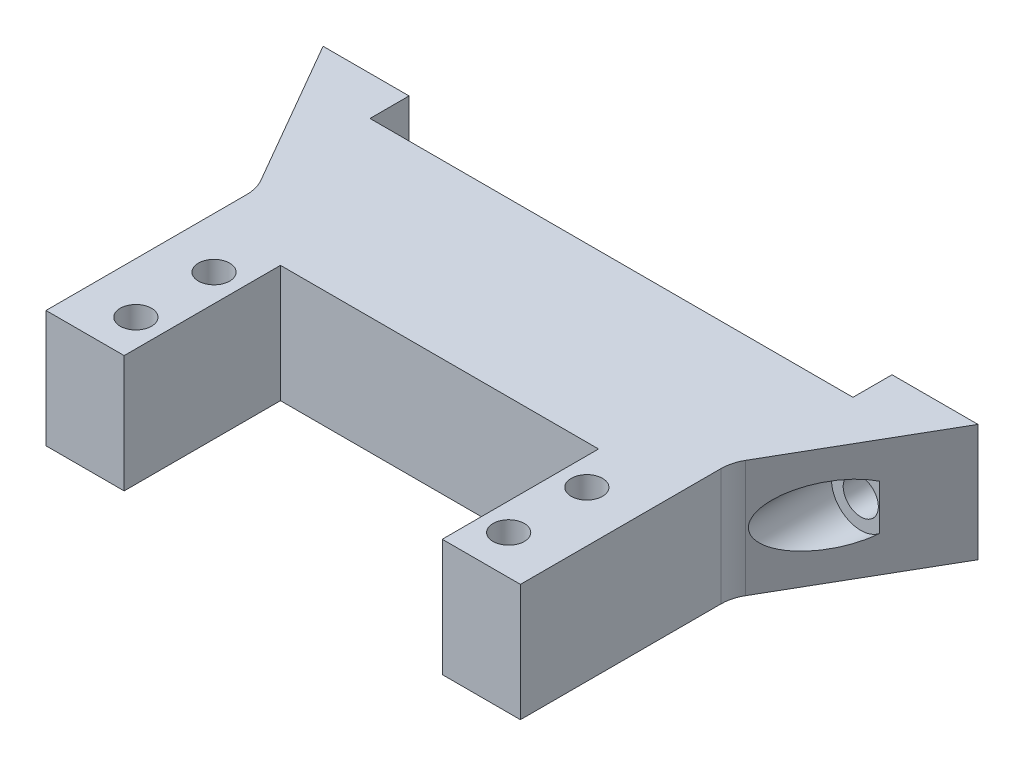
ISO-10303-21;
HEADER;
FILE_DESCRIPTION(('STEP AP214'),'2;1');
FILE_NAME('part.step','',(''),(''),'','','');
FILE_SCHEMA(('AUTOMOTIVE_DESIGN { 1 0 10303 214 1 1 1 1 }'));
ENDSEC;
DATA;
#1=APPLICATION_CONTEXT('core data for automotive mechanical design processes');
#2=APPLICATION_PROTOCOL_DEFINITION('international standard','automotive_design',2000,#1);
#3=PRODUCT_CONTEXT('',#1,'mechanical');
#4=PRODUCT('Part','Part','',(#3));
#5=PRODUCT_RELATED_PRODUCT_CATEGORY('part','',(#4));
#6=PRODUCT_DEFINITION_FORMATION('','',#4);
#7=PRODUCT_DEFINITION_CONTEXT('part definition',#1,'design');
#8=PRODUCT_DEFINITION('design','',#6,#7);
#9=PRODUCT_DEFINITION_SHAPE('','',#8);
#10=(LENGTH_UNIT() NAMED_UNIT(*) SI_UNIT(.MILLI.,.METRE.));
#11=(NAMED_UNIT(*) PLANE_ANGLE_UNIT() SI_UNIT($,.RADIAN.));
#12=(NAMED_UNIT(*) SI_UNIT($,.STERADIAN.) SOLID_ANGLE_UNIT());
#13=UNCERTAINTY_MEASURE_WITH_UNIT(LENGTH_MEASURE(1.E-05),#10,'distance_accuracy_value','');
#14=(GEOMETRIC_REPRESENTATION_CONTEXT(3) GLOBAL_UNCERTAINTY_ASSIGNED_CONTEXT((#13)) GLOBAL_UNIT_ASSIGNED_CONTEXT((#10,
#11,#12)) REPRESENTATION_CONTEXT('',''));
#15=CARTESIAN_POINT('',(0.,0.,0.));
#16=DIRECTION('',(0.,0.,1.));
#17=DIRECTION('',(1.,0.,0.));
#18=AXIS2_PLACEMENT_3D('',#15,#16,#17);
#19=CARTESIAN_POINT('',(41.8970053837926,-15.,-37.));
#20=DIRECTION('',(0.,0.,-1.));
#21=DIRECTION('',(-1.,0.,0.));
#22=AXIS2_PLACEMENT_3D('',#19,#20,#21);
#23=PLANE('',#22);
#24=DIRECTION('',(0.,-1.,0.));
#25=VECTOR('',#24,1.);
#26=CARTESIAN_POINT('',(30.8970053837926,0.,-37.));
#27=LINE('',#26,#25);
#28=CARTESIAN_POINT('',(30.8970053837926,0.,-37.));
#29=VERTEX_POINT('',#28);
#30=CARTESIAN_POINT('',(30.8970053837926,-15.,-37.));
#31=VERTEX_POINT('',#30);
#32=EDGE_CURVE('E207',#29,#31,#27,.T.);
#33=ORIENTED_EDGE('',*,*,#32,.F.);
#34=DIRECTION('',(-1.,0.,0.));
#35=VECTOR('',#34,1.);
#36=CARTESIAN_POINT('',(41.8970053837926,0.,-37.));
#37=LINE('',#36,#35);
#38=CARTESIAN_POINT('',(41.8970053837926,0.,-37.));
#39=VERTEX_POINT('',#38);
#40=EDGE_CURVE('E338',#39,#29,#37,.T.);
#41=ORIENTED_EDGE('',*,*,#40,.F.);
#42=DIRECTION('',(0.,1.,0.));
#43=VECTOR('',#42,1.);
#44=CARTESIAN_POINT('',(41.8970053837926,-15.,-37.));
#45=LINE('',#44,#43);
#46=CARTESIAN_POINT('',(41.8970053837926,-15.,-37.));
#47=VERTEX_POINT('',#46);
#48=EDGE_CURVE('E387',#47,#39,#45,.T.);
#49=ORIENTED_EDGE('',*,*,#48,.F.);
#50=DIRECTION('',(-1.,0.,0.));
#51=VECTOR('',#50,1.);
#52=CARTESIAN_POINT('',(41.8970053837926,-15.,-37.));
#53=LINE('',#52,#51);
#54=EDGE_CURVE('E289',#47,#31,#53,.T.);
#55=ORIENTED_EDGE('',*,*,#54,.T.);
#56=EDGE_LOOP('',(#33,#41,#49,#55));
#57=FACE_BOUND('',#56,.T.);
#58=CARTESIAN_POINT('',(34.8970053837926,-7.5,-37.));
#59=DIRECTION('',(0.,0.,-1.));
#60=DIRECTION('',(1.,0.,0.));
#61=AXIS2_PLACEMENT_3D('',#58,#59,#60);
#62=CIRCLE('',#61,2.25);
#63=CARTESIAN_POINT('',(37.1470053837926,-7.5,-37.));
#64=VERTEX_POINT('',#63);
#65=EDGE_CURVE('E223',#64,#64,#62,.T.);
#66=ORIENTED_EDGE('',*,*,#65,.F.);
#67=EDGE_LOOP('',(#66));
#68=FACE_BOUND('',#67,.T.);
#69=ADVANCED_FACE('F45',(#57,#68),#23,.T.);
#70=CARTESIAN_POINT('',(20.35,-15.,-10.));
#71=DIRECTION('',(-1.,0.,0.));
#72=DIRECTION('',(0.,0.,1.));
#73=AXIS2_PLACEMENT_3D('',#70,#71,#72);
#74=PLANE('',#73);
#75=DIRECTION('',(0.,0.,1.));
#76=VECTOR('',#75,1.);
#77=CARTESIAN_POINT('',(20.35,0.,-10.));
#78=LINE('',#77,#76);
#79=CARTESIAN_POINT('',(20.35,0.,-10.));
#80=VERTEX_POINT('',#79);
#81=CARTESIAN_POINT('',(20.35,0.,9.99999999999999));
#82=VERTEX_POINT('',#81);
#83=EDGE_CURVE('E263',#80,#82,#78,.T.);
#84=ORIENTED_EDGE('',*,*,#83,.F.);
#85=DIRECTION('',(0.,1.,0.));
#86=VECTOR('',#85,1.);
#87=CARTESIAN_POINT('',(20.35,-15.,-10.));
#88=LINE('',#87,#86);
#89=CARTESIAN_POINT('',(20.35,-15.,-10.));
#90=VERTEX_POINT('',#89);
#91=EDGE_CURVE('E364',#90,#80,#88,.T.);
#92=ORIENTED_EDGE('',*,*,#91,.F.);
#93=DIRECTION('',(0.,0.,1.));
#94=VECTOR('',#93,1.);
#95=CARTESIAN_POINT('',(20.35,-15.,-10.));
#96=LINE('',#95,#94);
#97=CARTESIAN_POINT('',(20.35,-15.,9.99999999999999));
#98=VERTEX_POINT('',#97);
#99=EDGE_CURVE('E267',#90,#98,#96,.T.);
#100=ORIENTED_EDGE('',*,*,#99,.T.);
#101=DIRECTION('',(0.,1.,0.));
#102=VECTOR('',#101,1.);
#103=CARTESIAN_POINT('',(20.35,-15.,9.99999999999999));
#104=LINE('',#103,#102);
#105=EDGE_CURVE('E317',#98,#82,#104,.T.);
#106=ORIENTED_EDGE('',*,*,#105,.T.);
#107=EDGE_LOOP('',(#84,#92,#100,#106));
#108=FACE_BOUND('',#107,.T.);
#109=ADVANCED_FACE('F47',(#108),#74,.T.);
#110=CARTESIAN_POINT('',(-20.35,-15.,-10.));
#111=DIRECTION('',(0.,0.,1.));
#112=DIRECTION('',(1.,0.,0.));
#113=AXIS2_PLACEMENT_3D('',#110,#111,#112);
#114=PLANE('',#113);
#115=DIRECTION('',(1.,0.,0.));
#116=VECTOR('',#115,1.);
#117=CARTESIAN_POINT('',(-20.35,0.,-10.));
#118=LINE('',#117,#116);
#119=CARTESIAN_POINT('',(-20.35,0.,-10.));
#120=VERTEX_POINT('',#119);
#121=EDGE_CURVE('E272',#120,#80,#118,.T.);
#122=ORIENTED_EDGE('',*,*,#121,.F.);
#123=DIRECTION('',(0.,1.,0.));
#124=VECTOR('',#123,1.);
#125=CARTESIAN_POINT('',(-20.35,-15.,-10.));
#126=LINE('',#125,#124);
#127=CARTESIAN_POINT('',(-20.35,-15.,-10.));
#128=VERTEX_POINT('',#127);
#129=EDGE_CURVE('E368',#128,#120,#126,.T.);
#130=ORIENTED_EDGE('',*,*,#129,.F.);
#131=DIRECTION('',(1.,0.,0.));
#132=VECTOR('',#131,1.);
#133=CARTESIAN_POINT('',(-20.35,-15.,-10.));
#134=LINE('',#133,#132);
#135=EDGE_CURVE('E313',#128,#90,#134,.T.);
#136=ORIENTED_EDGE('',*,*,#135,.T.);
#137=ORIENTED_EDGE('',*,*,#91,.T.);
#138=EDGE_LOOP('',(#122,#130,#136,#137));
#139=FACE_BOUND('',#138,.T.);
#140=ADVANCED_FACE('F435',(#139),#114,.T.);
#141=CARTESIAN_POINT('',(-20.35,-15.,10.));
#142=DIRECTION('',(1.,0.,0.));
#143=DIRECTION('',(0.,0.,-1.));
#144=AXIS2_PLACEMENT_3D('',#141,#142,#143);
#145=PLANE('',#144);
#146=DIRECTION('',(0.,0.,-1.));
#147=VECTOR('',#146,1.);
#148=CARTESIAN_POINT('',(-20.35,0.,10.));
#149=LINE('',#148,#147);
#150=CARTESIAN_POINT('',(-20.35,0.,10.));
#151=VERTEX_POINT('',#150);
#152=EDGE_CURVE('E357',#151,#120,#149,.T.);
#153=ORIENTED_EDGE('',*,*,#152,.F.);
#154=DIRECTION('',(0.,1.,0.));
#155=VECTOR('',#154,1.);
#156=CARTESIAN_POINT('',(-20.35,-15.,10.));
#157=LINE('',#156,#155);
#158=CARTESIAN_POINT('',(-20.35,-15.,10.));
#159=VERTEX_POINT('',#158);
#160=EDGE_CURVE('E371',#159,#151,#157,.T.);
#161=ORIENTED_EDGE('',*,*,#160,.F.);
#162=DIRECTION('',(0.,0.,-1.));
#163=VECTOR('',#162,1.);
#164=CARTESIAN_POINT('',(-20.35,-15.,10.));
#165=LINE('',#164,#163);
#166=EDGE_CURVE('E309',#159,#128,#165,.T.);
#167=ORIENTED_EDGE('',*,*,#166,.T.);
#168=ORIENTED_EDGE('',*,*,#129,.T.);
#169=EDGE_LOOP('',(#153,#161,#167,#168));
#170=FACE_BOUND('',#169,.T.);
#171=ADVANCED_FACE('F495',(#170),#145,.T.);
#172=CARTESIAN_POINT('',(-20.35,-15.,10.));
#173=DIRECTION('',(0.,0.,1.));
#174=DIRECTION('',(1.,0.,0.));
#175=AXIS2_PLACEMENT_3D('',#172,#173,#174);
#176=PLANE('',#175);
#177=DIRECTION('',(1.,0.,0.));
#178=VECTOR('',#177,1.);
#179=CARTESIAN_POINT('',(-20.35,0.,10.));
#180=LINE('',#179,#178);
#181=CARTESIAN_POINT('',(-30.35,0.,10.));
#182=VERTEX_POINT('',#181);
#183=EDGE_CURVE('E353',#182,#151,#180,.T.);
#184=ORIENTED_EDGE('',*,*,#183,.F.);
#185=DIRECTION('',(0.,1.,0.));
#186=VECTOR('',#185,1.);
#187=CARTESIAN_POINT('',(-30.35,-15.,10.));
#188=LINE('',#187,#186);
#189=CARTESIAN_POINT('',(-30.35,-15.,10.));
#190=VERTEX_POINT('',#189);
#191=EDGE_CURVE('E374',#190,#182,#188,.T.);
#192=ORIENTED_EDGE('',*,*,#191,.F.);
#193=DIRECTION('',(1.,0.,0.));
#194=VECTOR('',#193,1.);
#195=CARTESIAN_POINT('',(-20.35,-15.,10.));
#196=LINE('',#195,#194);
#197=EDGE_CURVE('E305',#190,#159,#196,.T.);
#198=ORIENTED_EDGE('',*,*,#197,.T.);
#199=ORIENTED_EDGE('',*,*,#160,.T.);
#200=EDGE_LOOP('',(#184,#192,#198,#199));
#201=FACE_BOUND('',#200,.T.);
#202=ADVANCED_FACE('F499',(#201),#176,.T.);
#203=CARTESIAN_POINT('',(-30.35,-15.,10.));
#204=DIRECTION('',(-1.,0.,0.));
#205=DIRECTION('',(0.,0.,1.));
#206=AXIS2_PLACEMENT_3D('',#203,#204,#205);
#207=PLANE('',#206);
#208=DIRECTION('',(0.,0.,1.));
#209=VECTOR('',#208,1.);
#210=CARTESIAN_POINT('',(-30.35,0.,10.));
#211=LINE('',#210,#209);
#212=CARTESIAN_POINT('',(-30.35,0.,-15.6602540378444));
#213=VERTEX_POINT('',#212);
#214=EDGE_CURVE('E349',#213,#182,#211,.T.);
#215=ORIENTED_EDGE('',*,*,#214,.F.);
#216=DIRECTION('',(0.,1.,0.));
#217=VECTOR('',#216,1.);
#218=CARTESIAN_POINT('',(-30.35,-15.,-15.6602540378444));
#219=LINE('',#218,#217);
#220=CARTESIAN_POINT('',(-30.35,-15.,-15.6602540378444));
#221=VERTEX_POINT('',#220);
#222=EDGE_CURVE('E377',#221,#213,#219,.T.);
#223=ORIENTED_EDGE('',*,*,#222,.F.);
#224=DIRECTION('',(0.,0.,1.));
#225=VECTOR('',#224,1.);
#226=CARTESIAN_POINT('',(-30.35,-15.,10.));
#227=LINE('',#226,#225);
#228=EDGE_CURVE('E301',#221,#190,#227,.T.);
#229=ORIENTED_EDGE('',*,*,#228,.T.);
#230=ORIENTED_EDGE('',*,*,#191,.T.);
#231=EDGE_LOOP('',(#215,#223,#229,#230));
#232=FACE_BOUND('',#231,.T.);
#233=ADVANCED_FACE('F503',(#232),#207,.T.);
#234=CARTESIAN_POINT('',(-35.35,-15.,-15.6602540378444));
#235=DIRECTION('',(0.,1.,0.));
#236=DIRECTION('',(0.,0.,1.));
#237=AXIS2_PLACEMENT_3D('',#234,#235,#236);
#238=CYLINDRICAL_SURFACE('',#237,4.99999999999999);
#239=CARTESIAN_POINT('',(-35.35,0.,-15.6602540378444));
#240=DIRECTION('',(0.,-1.,0.));
#241=DIRECTION('',(0.,0.,1.));
#242=AXIS2_PLACEMENT_3D('',#239,#240,#241);
#243=CIRCLE('',#242,4.99999999999999);
#244=CARTESIAN_POINT('',(-31.0198729810778,0.,-18.1602540378444));
#245=VERTEX_POINT('',#244);
#246=EDGE_CURVE('E345',#245,#213,#243,.T.);
#247=ORIENTED_EDGE('',*,*,#246,.F.);
#248=DIRECTION('',(0.,1.,0.));
#249=VECTOR('',#248,1.);
#250=CARTESIAN_POINT('',(-31.0198729810778,-15.,-18.1602540378444));
#251=LINE('',#250,#249);
#252=CARTESIAN_POINT('',(-31.0198729810778,-15.,-18.1602540378444));
#253=VERTEX_POINT('',#252);
#254=EDGE_CURVE('E380',#253,#245,#251,.T.);
#255=ORIENTED_EDGE('',*,*,#254,.F.);
#256=CARTESIAN_POINT('',(-35.35,-15.,-15.6602540378444));
#257=DIRECTION('',(0.,-1.,0.));
#258=DIRECTION('',(0.,0.,1.));
#259=AXIS2_PLACEMENT_3D('',#256,#257,#258);
#260=CIRCLE('',#259,4.99999999999999);
#261=EDGE_CURVE('E297',#253,#221,#260,.T.);
#262=ORIENTED_EDGE('',*,*,#261,.T.);
#263=ORIENTED_EDGE('',*,*,#222,.T.);
#264=EDGE_LOOP('',(#247,#255,#262,#263));
#265=FACE_BOUND('',#264,.T.);
#266=ADVANCED_FACE('F450',(#265),#238,.F.);
#267=CARTESIAN_POINT('',(-31.0198729810778,-15.,-18.1602540378444));
#268=DIRECTION('',(-0.866025403784438,0.,0.500000000000002));
#269=DIRECTION('',(0.500000000000002,0.,0.866025403784438));
#270=AXIS2_PLACEMENT_3D('',#267,#268,#269);
#271=PLANE('',#270);
#272=CARTESIAN_POINT('',(-34.8970053837926,-7.5,-24.8756443470179));
#273=DIRECTION('',(-0.866025403784438,0.,0.500000000000002));
#274=DIRECTION('',(-0.500000000000002,0.,-0.866025403784438));
#275=AXIS2_PLACEMENT_3D('',#272,#273,#274);
#276=ELLIPSE('',#275,7.49999999999998,3.75);
#277=CARTESIAN_POINT('',(-37.2782032302755,-10.3969633784197,-29.));
#278=VERTEX_POINT('',#277);
#279=CARTESIAN_POINT('',(-37.2782032302755,-4.60303662158031,-29.));
#280=VERTEX_POINT('',#279);
#281=EDGE_CURVE('E11',#278,#280,#276,.T.);
#282=ORIENTED_EDGE('',*,*,#281,.F.);
#283=DIRECTION('',(0.,1.,0.));
#284=VECTOR('',#283,1.);
#285=CARTESIAN_POINT('',(-37.2782032302755,-15.,-29.));
#286=LINE('',#285,#284);
#287=EDGE_CURVE('E54',#278,#280,#286,.T.);
#288=ORIENTED_EDGE('',*,*,#287,.T.);
#289=EDGE_LOOP('',(#282,#288));
#290=FACE_BOUND('',#289,.T.);
#291=DIRECTION('',(0.500000000000002,0.,0.866025403784438));
#292=VECTOR('',#291,1.);
#293=CARTESIAN_POINT('',(-31.0198729810778,0.,-18.1602540378444));
#294=LINE('',#293,#292);
#295=CARTESIAN_POINT('',(-41.8970053837926,0.,-37.));
#296=VERTEX_POINT('',#295);
#297=EDGE_CURVE('E341',#296,#245,#294,.T.);
#298=ORIENTED_EDGE('',*,*,#297,.F.);
#299=DIRECTION('',(0.,1.,0.));
#300=VECTOR('',#299,1.);
#301=CARTESIAN_POINT('',(-41.8970053837926,-15.,-37.));
#302=LINE('',#301,#300);
#303=CARTESIAN_POINT('',(-41.8970053837926,-15.,-37.));
#304=VERTEX_POINT('',#303);
#305=EDGE_CURVE('E383',#304,#296,#302,.T.);
#306=ORIENTED_EDGE('',*,*,#305,.F.);
#307=DIRECTION('',(0.500000000000002,0.,0.866025403784438));
#308=VECTOR('',#307,1.);
#309=CARTESIAN_POINT('',(-31.0198729810778,-15.,-18.1602540378444));
#310=LINE('',#309,#308);
#311=EDGE_CURVE('E293',#304,#253,#310,.T.);
#312=ORIENTED_EDGE('',*,*,#311,.T.);
#313=ORIENTED_EDGE('',*,*,#254,.T.);
#314=EDGE_LOOP('',(#298,#306,#312,#313));
#315=FACE_BOUND('',#314,.T.);
#316=ADVANCED_FACE('F410',(#290,#315),#271,.T.);
#317=DIRECTION('',(0.,-1.,0.));
#318=VECTOR('',#317,1.);
#319=CARTESIAN_POINT('',(-30.8970053837926,0.,-37.));
#320=LINE('',#319,#318);
#321=CARTESIAN_POINT('',(-30.8970053837926,0.,-37.));
#322=VERTEX_POINT('',#321);
#323=CARTESIAN_POINT('',(-30.8970053837926,-15.,-37.));
#324=VERTEX_POINT('',#323);
#325=EDGE_CURVE('E61',#322,#324,#320,.T.);
#326=ORIENTED_EDGE('',*,*,#325,.T.);
#327=EDGE_CURVE('E288',#324,#304,#53,.T.);
#328=ORIENTED_EDGE('',*,*,#327,.T.);
#329=ORIENTED_EDGE('',*,*,#305,.T.);
#330=EDGE_CURVE('E337',#322,#296,#37,.T.);
#331=ORIENTED_EDGE('',*,*,#330,.F.);
#332=EDGE_LOOP('',(#326,#328,#329,#331));
#333=FACE_BOUND('',#332,.T.);
#334=CARTESIAN_POINT('',(-34.8970053837926,-7.5,-37.));
#335=DIRECTION('',(0.,0.,-1.));
#336=DIRECTION('',(-1.,0.,0.));
#337=AXIS2_PLACEMENT_3D('',#334,#335,#336);
#338=CIRCLE('',#337,2.25);
#339=CARTESIAN_POINT('',(-37.1470053837926,-7.5,-37.));
#340=VERTEX_POINT('',#339);
#341=EDGE_CURVE('E224',#340,#340,#338,.T.);
#342=ORIENTED_EDGE('',*,*,#341,.F.);
#343=EDGE_LOOP('',(#342));
#344=FACE_BOUND('',#343,.T.);
#345=ADVANCED_FACE('F430',(#333,#344),#23,.T.);
#346=CARTESIAN_POINT('',(31.0198729810778,-15.,-18.1602540378444));
#347=DIRECTION('',(0.866025403784438,0.,0.500000000000001));
#348=DIRECTION('',(0.500000000000001,0.,-0.866025403784438));
#349=AXIS2_PLACEMENT_3D('',#346,#347,#348);
#350=PLANE('',#349);
#351=CARTESIAN_POINT('',(34.8970053837926,-7.5,-24.8756443470179));
#352=DIRECTION('',(0.866025403784438,0.,0.500000000000001));
#353=DIRECTION('',(0.500000000000001,0.,-0.866025403784438));
#354=AXIS2_PLACEMENT_3D('',#351,#352,#353);
#355=ELLIPSE('',#354,7.49999999999998,3.75);
#356=CARTESIAN_POINT('',(37.2782032302755,-4.6030366215803,-29.));
#357=VERTEX_POINT('',#356);
#358=CARTESIAN_POINT('',(37.2782032302755,-10.3969633784197,-29.));
#359=VERTEX_POINT('',#358);
#360=EDGE_CURVE('E403',#357,#359,#355,.T.);
#361=ORIENTED_EDGE('',*,*,#360,.F.);
#362=DIRECTION('',(0.,1.,0.));
#363=VECTOR('',#362,1.);
#364=CARTESIAN_POINT('',(37.2782032302755,-15.,-29.));
#365=LINE('',#364,#363);
#366=EDGE_CURVE('E367',#359,#357,#365,.T.);
#367=ORIENTED_EDGE('',*,*,#366,.F.);
#368=EDGE_LOOP('',(#361,#367));
#369=FACE_BOUND('',#368,.T.);
#370=DIRECTION('',(0.500000000000001,0.,-0.866025403784438));
#371=VECTOR('',#370,1.);
#372=CARTESIAN_POINT('',(31.0198729810778,0.,-18.1602540378444));
#373=LINE('',#372,#371);
#374=CARTESIAN_POINT('',(31.0198729810778,0.,-18.1602540378444));
#375=VERTEX_POINT('',#374);
#376=EDGE_CURVE('E333',#375,#39,#373,.T.);
#377=ORIENTED_EDGE('',*,*,#376,.F.);
#378=DIRECTION('',(0.,1.,0.));
#379=VECTOR('',#378,1.);
#380=CARTESIAN_POINT('',(31.0198729810778,-15.,-18.1602540378444));
#381=LINE('',#380,#379);
#382=CARTESIAN_POINT('',(31.0198729810778,-15.,-18.1602540378444));
#383=VERTEX_POINT('',#382);
#384=EDGE_CURVE('E390',#383,#375,#381,.T.);
#385=ORIENTED_EDGE('',*,*,#384,.F.);
#386=DIRECTION('',(0.500000000000001,0.,-0.866025403784438));
#387=VECTOR('',#386,1.);
#388=CARTESIAN_POINT('',(31.0198729810778,-15.,-18.1602540378444));
#389=LINE('',#388,#387);
#390=EDGE_CURVE('E284',#383,#47,#389,.T.);
#391=ORIENTED_EDGE('',*,*,#390,.T.);
#392=ORIENTED_EDGE('',*,*,#48,.T.);
#393=EDGE_LOOP('',(#377,#385,#391,#392));
#394=FACE_BOUND('',#393,.T.);
#395=ADVANCED_FACE('F441',(#369,#394),#350,.T.);
#396=CARTESIAN_POINT('',(35.35,-15.,-15.6602540378444));
#397=DIRECTION('',(0.,1.,0.));
#398=DIRECTION('',(0.,0.,1.));
#399=AXIS2_PLACEMENT_3D('',#396,#397,#398);
#400=CYLINDRICAL_SURFACE('',#399,4.99999999999999);
#401=CARTESIAN_POINT('',(35.35,0.,-15.6602540378444));
#402=DIRECTION('',(0.,-1.,0.));
#403=DIRECTION('',(0.,0.,-1.));
#404=AXIS2_PLACEMENT_3D('',#401,#402,#403);
#405=CIRCLE('',#404,4.99999999999999);
#406=CARTESIAN_POINT('',(30.35,0.,-15.6602540378444));
#407=VERTEX_POINT('',#406);
#408=EDGE_CURVE('E329',#407,#375,#405,.T.);
#409=ORIENTED_EDGE('',*,*,#408,.F.);
#410=DIRECTION('',(0.,1.,0.));
#411=VECTOR('',#410,1.);
#412=CARTESIAN_POINT('',(30.35,-15.,-15.6602540378444));
#413=LINE('',#412,#411);
#414=CARTESIAN_POINT('',(30.35,-15.,-15.6602540378444));
#415=VERTEX_POINT('',#414);
#416=EDGE_CURVE('E393',#415,#407,#413,.T.);
#417=ORIENTED_EDGE('',*,*,#416,.F.);
#418=CARTESIAN_POINT('',(35.35,-15.,-15.6602540378444));
#419=DIRECTION('',(0.,-1.,0.));
#420=DIRECTION('',(0.,0.,-1.));
#421=AXIS2_PLACEMENT_3D('',#418,#419,#420);
#422=CIRCLE('',#421,4.99999999999999);
#423=EDGE_CURVE('E280',#415,#383,#422,.T.);
#424=ORIENTED_EDGE('',*,*,#423,.T.);
#425=ORIENTED_EDGE('',*,*,#384,.T.);
#426=EDGE_LOOP('',(#409,#417,#424,#425));
#427=FACE_BOUND('',#426,.T.);
#428=ADVANCED_FACE('F447',(#427),#400,.F.);
#429=CARTESIAN_POINT('',(30.35,-15.,10.));
#430=DIRECTION('',(1.,0.,0.));
#431=DIRECTION('',(0.,0.,-1.));
#432=AXIS2_PLACEMENT_3D('',#429,#430,#431);
#433=PLANE('',#432);
#434=DIRECTION('',(0.,0.,-1.));
#435=VECTOR('',#434,1.);
#436=CARTESIAN_POINT('',(30.35,0.,10.));
#437=LINE('',#436,#435);
#438=CARTESIAN_POINT('',(30.35,0.,10.));
#439=VERTEX_POINT('',#438);
#440=EDGE_CURVE('E325',#439,#407,#437,.T.);
#441=ORIENTED_EDGE('',*,*,#440,.F.);
#442=DIRECTION('',(0.,1.,0.));
#443=VECTOR('',#442,1.);
#444=CARTESIAN_POINT('',(30.35,-15.,10.));
#445=LINE('',#444,#443);
#446=CARTESIAN_POINT('',(30.35,-15.,10.));
#447=VERTEX_POINT('',#446);
#448=EDGE_CURVE('E396',#447,#439,#445,.T.);
#449=ORIENTED_EDGE('',*,*,#448,.F.);
#450=DIRECTION('',(0.,0.,-1.));
#451=VECTOR('',#450,1.);
#452=CARTESIAN_POINT('',(30.35,-15.,10.));
#453=LINE('',#452,#451);
#454=EDGE_CURVE('E276',#447,#415,#453,.T.);
#455=ORIENTED_EDGE('',*,*,#454,.T.);
#456=ORIENTED_EDGE('',*,*,#416,.T.);
#457=EDGE_LOOP('',(#441,#449,#455,#456));
#458=FACE_BOUND('',#457,.T.);
#459=ADVANCED_FACE('F536',(#458),#433,.T.);
#460=CARTESIAN_POINT('',(20.35,-15.,9.99999999999999));
#461=DIRECTION('',(0.,0.,1.));
#462=DIRECTION('',(1.,0.,0.));
#463=AXIS2_PLACEMENT_3D('',#460,#461,#462);
#464=PLANE('',#463);
#465=DIRECTION('',(1.,0.,0.));
#466=VECTOR('',#465,1.);
#467=CARTESIAN_POINT('',(20.35,0.,9.99999999999999));
#468=LINE('',#467,#466);
#469=EDGE_CURVE('E321',#82,#439,#468,.T.);
#470=ORIENTED_EDGE('',*,*,#469,.F.);
#471=ORIENTED_EDGE('',*,*,#105,.F.);
#472=DIRECTION('',(1.,0.,0.));
#473=VECTOR('',#472,1.);
#474=CARTESIAN_POINT('',(20.35,-15.,9.99999999999999));
#475=LINE('',#474,#473);
#476=EDGE_CURVE('E271',#98,#447,#475,.T.);
#477=ORIENTED_EDGE('',*,*,#476,.T.);
#478=ORIENTED_EDGE('',*,*,#448,.T.);
#479=EDGE_LOOP('',(#470,#471,#477,#478));
#480=FACE_BOUND('',#479,.T.);
#481=ADVANCED_FACE('F488',(#480),#464,.T.);
#482=CARTESIAN_POINT('',(35.35,-15.,-15.6602540378444));
#483=DIRECTION('',(0.,-1.,0.));
#484=DIRECTION('',(0.,0.,-1.));
#485=AXIS2_PLACEMENT_3D('',#482,#483,#484);
#486=PLANE('',#485);
#487=DIRECTION('',(0.,0.,1.));
#488=VECTOR('',#487,1.);
#489=CARTESIAN_POINT('',(30.8970053837926,-15.,-37.));
#490=LINE('',#489,#488);
#491=CARTESIAN_POINT('',(30.8970053837926,-15.,-32.));
#492=VERTEX_POINT('',#491);
#493=EDGE_CURVE('E191',#31,#492,#490,.T.);
#494=ORIENTED_EDGE('',*,*,#493,.F.);
#495=ORIENTED_EDGE('',*,*,#54,.F.);
#496=ORIENTED_EDGE('',*,*,#390,.F.);
#497=ORIENTED_EDGE('',*,*,#423,.F.);
#498=ORIENTED_EDGE('',*,*,#454,.F.);
#499=ORIENTED_EDGE('',*,*,#476,.F.);
#500=ORIENTED_EDGE('',*,*,#99,.F.);
#501=ORIENTED_EDGE('',*,*,#135,.F.);
#502=ORIENTED_EDGE('',*,*,#166,.F.);
#503=ORIENTED_EDGE('',*,*,#197,.F.);
#504=ORIENTED_EDGE('',*,*,#228,.F.);
#505=ORIENTED_EDGE('',*,*,#261,.F.);
#506=ORIENTED_EDGE('',*,*,#311,.F.);
#507=ORIENTED_EDGE('',*,*,#327,.F.);
#508=DIRECTION('',(0.,0.,-1.));
#509=VECTOR('',#508,1.);
#510=CARTESIAN_POINT('',(-30.8970053837926,-15.,-37.));
#511=LINE('',#510,#509);
#512=CARTESIAN_POINT('',(-30.8970053837926,-15.,-32.));
#513=VERTEX_POINT('',#512);
#514=EDGE_CURVE('E195',#513,#324,#511,.T.);
#515=ORIENTED_EDGE('',*,*,#514,.F.);
#516=DIRECTION('',(-1.,0.,0.));
#517=VECTOR('',#516,1.);
#518=CARTESIAN_POINT('',(-30.8970053837926,-15.,-32.));
#519=LINE('',#518,#517);
#520=EDGE_CURVE('E177',#492,#513,#519,.T.);
#521=ORIENTED_EDGE('',*,*,#520,.F.);
#522=EDGE_LOOP('',(#494,#495,#496,#497,#498,#499,#500,#501,#502,#503,#504,#505,#506,#507,#515,#521));
#523=FACE_BOUND('',#522,.T.);
#524=CARTESIAN_POINT('',(23.85,-15.,5.));
#525=DIRECTION('',(0.,1.,0.));
#526=DIRECTION('',(0.,0.,-1.));
#527=AXIS2_PLACEMENT_3D('',#524,#525,#526);
#528=CIRCLE('',#527,2.);
#529=CARTESIAN_POINT('',(23.85,-15.,3.));
#530=VERTEX_POINT('',#529);
#531=EDGE_CURVE('E235',#530,#530,#528,.T.);
#532=ORIENTED_EDGE('',*,*,#531,.T.);
#533=EDGE_LOOP('',(#532));
#534=FACE_BOUND('',#533,.T.);
#535=CARTESIAN_POINT('',(23.85,-15.,-5.));
#536=DIRECTION('',(0.,1.,0.));
#537=DIRECTION('',(0.,0.,-1.));
#538=AXIS2_PLACEMENT_3D('',#535,#536,#537);
#539=CIRCLE('',#538,2.);
#540=CARTESIAN_POINT('',(23.85,-15.,-7.));
#541=VERTEX_POINT('',#540);
#542=EDGE_CURVE('E243',#541,#541,#539,.T.);
#543=ORIENTED_EDGE('',*,*,#542,.T.);
#544=EDGE_LOOP('',(#543));
#545=FACE_BOUND('',#544,.T.);
#546=CARTESIAN_POINT('',(-23.85,-15.,5.));
#547=DIRECTION('',(0.,1.,0.));
#548=DIRECTION('',(0.,0.,1.));
#549=AXIS2_PLACEMENT_3D('',#546,#547,#548);
#550=CIRCLE('',#549,2.);
#551=CARTESIAN_POINT('',(-23.85,-15.,7.));
#552=VERTEX_POINT('',#551);
#553=EDGE_CURVE('E251',#552,#552,#550,.T.);
#554=ORIENTED_EDGE('',*,*,#553,.T.);
#555=EDGE_LOOP('',(#554));
#556=FACE_BOUND('',#555,.T.);
#557=CARTESIAN_POINT('',(-23.85,-15.,-5.));
#558=DIRECTION('',(0.,1.,0.));
#559=DIRECTION('',(0.,0.,1.));
#560=AXIS2_PLACEMENT_3D('',#557,#558,#559);
#561=CIRCLE('',#560,2.);
#562=CARTESIAN_POINT('',(-23.85,-15.,-3.));
#563=VERTEX_POINT('',#562);
#564=EDGE_CURVE('E259',#563,#563,#561,.T.);
#565=ORIENTED_EDGE('',*,*,#564,.T.);
#566=EDGE_LOOP('',(#565));
#567=FACE_BOUND('',#566,.T.);
#568=ADVANCED_FACE('F486',(#523,#534,#545,#556,#567),#486,.T.);
#569=CARTESIAN_POINT('',(35.35,0.,-15.6602540378444));
#570=DIRECTION('',(0.,-1.,0.));
#571=DIRECTION('',(0.,0.,-1.));
#572=AXIS2_PLACEMENT_3D('',#569,#570,#571);
#573=PLANE('',#572);
#574=CARTESIAN_POINT('',(23.85,0.,5.));
#575=DIRECTION('',(0.,1.,0.));
#576=DIRECTION('',(0.,0.,-1.));
#577=AXIS2_PLACEMENT_3D('',#574,#575,#576);
#578=CIRCLE('',#577,2.);
#579=CARTESIAN_POINT('',(23.85,0.,3.));
#580=VERTEX_POINT('',#579);
#581=EDGE_CURVE('E228',#580,#580,#578,.T.);
#582=ORIENTED_EDGE('',*,*,#581,.F.);
#583=EDGE_LOOP('',(#582));
#584=FACE_BOUND('',#583,.T.);
#585=CARTESIAN_POINT('',(23.85,0.,-5.));
#586=DIRECTION('',(0.,1.,0.));
#587=DIRECTION('',(0.,0.,-1.));
#588=AXIS2_PLACEMENT_3D('',#585,#586,#587);
#589=CIRCLE('',#588,2.);
#590=CARTESIAN_POINT('',(23.85,0.,-7.));
#591=VERTEX_POINT('',#590);
#592=EDGE_CURVE('E239',#591,#591,#589,.T.);
#593=ORIENTED_EDGE('',*,*,#592,.F.);
#594=EDGE_LOOP('',(#593));
#595=FACE_BOUND('',#594,.T.);
#596=CARTESIAN_POINT('',(-23.85,0.,5.));
#597=DIRECTION('',(0.,1.,0.));
#598=DIRECTION('',(0.,0.,1.));
#599=AXIS2_PLACEMENT_3D('',#596,#597,#598);
#600=CIRCLE('',#599,2.);
#601=CARTESIAN_POINT('',(-23.85,0.,7.));
#602=VERTEX_POINT('',#601);
#603=EDGE_CURVE('E247',#602,#602,#600,.T.);
#604=ORIENTED_EDGE('',*,*,#603,.F.);
#605=EDGE_LOOP('',(#604));
#606=FACE_BOUND('',#605,.T.);
#607=CARTESIAN_POINT('',(-23.85,0.,-5.));
#608=DIRECTION('',(0.,1.,0.));
#609=DIRECTION('',(0.,0.,1.));
#610=AXIS2_PLACEMENT_3D('',#607,#608,#609);
#611=CIRCLE('',#610,2.);
#612=CARTESIAN_POINT('',(-23.85,0.,-3.));
#613=VERTEX_POINT('',#612);
#614=EDGE_CURVE('E255',#613,#613,#611,.T.);
#615=ORIENTED_EDGE('',*,*,#614,.F.);
#616=EDGE_LOOP('',(#615));
#617=FACE_BOUND('',#616,.T.);
#618=ORIENTED_EDGE('',*,*,#40,.T.);
#619=DIRECTION('',(0.,0.,1.));
#620=VECTOR('',#619,1.);
#621=CARTESIAN_POINT('',(30.8970053837926,0.,-37.));
#622=LINE('',#621,#620);
#623=CARTESIAN_POINT('',(30.8970053837926,0.,-32.));
#624=VERTEX_POINT('',#623);
#625=EDGE_CURVE('E180',#29,#624,#622,.T.);
#626=ORIENTED_EDGE('',*,*,#625,.T.);
#627=DIRECTION('',(-1.,0.,0.));
#628=VECTOR('',#627,1.);
#629=CARTESIAN_POINT('',(-30.8970053837926,0.,-32.));
#630=LINE('',#629,#628);
#631=CARTESIAN_POINT('',(-30.8970053837926,0.,-32.));
#632=VERTEX_POINT('',#631);
#633=EDGE_CURVE('E174',#624,#632,#630,.T.);
#634=ORIENTED_EDGE('',*,*,#633,.T.);
#635=DIRECTION('',(0.,0.,-1.));
#636=VECTOR('',#635,1.);
#637=CARTESIAN_POINT('',(-30.8970053837926,0.,-37.));
#638=LINE('',#637,#636);
#639=EDGE_CURVE('E182',#632,#322,#638,.T.);
#640=ORIENTED_EDGE('',*,*,#639,.T.);
#641=ORIENTED_EDGE('',*,*,#330,.T.);
#642=ORIENTED_EDGE('',*,*,#297,.T.);
#643=ORIENTED_EDGE('',*,*,#246,.T.);
#644=ORIENTED_EDGE('',*,*,#214,.T.);
#645=ORIENTED_EDGE('',*,*,#183,.T.);
#646=ORIENTED_EDGE('',*,*,#152,.T.);
#647=ORIENTED_EDGE('',*,*,#121,.T.);
#648=ORIENTED_EDGE('',*,*,#83,.T.);
#649=ORIENTED_EDGE('',*,*,#469,.T.);
#650=ORIENTED_EDGE('',*,*,#440,.T.);
#651=ORIENTED_EDGE('',*,*,#408,.T.);
#652=ORIENTED_EDGE('',*,*,#376,.T.);
#653=EDGE_LOOP('',(#618,#626,#634,#640,#641,#642,#643,#644,#645,#646,#647,#648,#649,#650,#651,#652));
#654=FACE_BOUND('',#653,.T.);
#655=ADVANCED_FACE('F189',(#584,#595,#606,#617,#654),#573,.F.);
#656=CARTESIAN_POINT('',(-23.85,-15.,-5.));
#657=DIRECTION('',(0.,1.,0.));
#658=DIRECTION('',(0.,0.,1.));
#659=AXIS2_PLACEMENT_3D('',#656,#657,#658);
#660=CYLINDRICAL_SURFACE('',#659,2.);
#661=ORIENTED_EDGE('',*,*,#564,.F.);
#662=EDGE_LOOP('',(#661));
#663=FACE_BOUND('',#662,.T.);
#664=ORIENTED_EDGE('',*,*,#614,.T.);
#665=EDGE_LOOP('',(#664));
#666=FACE_BOUND('',#665,.T.);
#667=ADVANCED_FACE('F481',(#663,#666),#660,.F.);
#668=CARTESIAN_POINT('',(-23.85,-15.,5.));
#669=DIRECTION('',(0.,1.,0.));
#670=DIRECTION('',(0.,0.,1.));
#671=AXIS2_PLACEMENT_3D('',#668,#669,#670);
#672=CYLINDRICAL_SURFACE('',#671,2.);
#673=ORIENTED_EDGE('',*,*,#553,.F.);
#674=EDGE_LOOP('',(#673));
#675=FACE_BOUND('',#674,.T.);
#676=ORIENTED_EDGE('',*,*,#603,.T.);
#677=EDGE_LOOP('',(#676));
#678=FACE_BOUND('',#677,.T.);
#679=ADVANCED_FACE('F477',(#675,#678),#672,.F.);
#680=CARTESIAN_POINT('',(23.85,-15.,-5.));
#681=DIRECTION('',(0.,1.,0.));
#682=DIRECTION('',(0.,0.,1.));
#683=AXIS2_PLACEMENT_3D('',#680,#681,#682);
#684=CYLINDRICAL_SURFACE('',#683,2.);
#685=ORIENTED_EDGE('',*,*,#542,.F.);
#686=EDGE_LOOP('',(#685));
#687=FACE_BOUND('',#686,.T.);
#688=ORIENTED_EDGE('',*,*,#592,.T.);
#689=EDGE_LOOP('',(#688));
#690=FACE_BOUND('',#689,.T.);
#691=ADVANCED_FACE('F473',(#687,#690),#684,.F.);
#692=CARTESIAN_POINT('',(23.85,-15.,5.));
#693=DIRECTION('',(0.,1.,0.));
#694=DIRECTION('',(0.,0.,1.));
#695=AXIS2_PLACEMENT_3D('',#692,#693,#694);
#696=CYLINDRICAL_SURFACE('',#695,2.);
#697=ORIENTED_EDGE('',*,*,#531,.F.);
#698=EDGE_LOOP('',(#697));
#699=FACE_BOUND('',#698,.T.);
#700=ORIENTED_EDGE('',*,*,#581,.T.);
#701=EDGE_LOOP('',(#700));
#702=FACE_BOUND('',#701,.T.);
#703=ADVANCED_FACE('F466',(#699,#702),#696,.F.);
#704=CARTESIAN_POINT('',(34.8970053837926,-7.5,-29.));
#705=DIRECTION('',(0.,0.,-1.));
#706=DIRECTION('',(-1.,0.,0.));
#707=AXIS2_PLACEMENT_3D('',#704,#705,#706);
#708=CYLINDRICAL_SURFACE('',#707,2.25);
#709=CARTESIAN_POINT('',(34.8970053837926,-7.5,-29.));
#710=DIRECTION('',(0.,0.,-1.));
#711=DIRECTION('',(1.,0.,0.));
#712=AXIS2_PLACEMENT_3D('',#709,#710,#711);
#713=CIRCLE('',#712,2.25);
#714=CARTESIAN_POINT('',(37.1470053837926,-7.5,-29.));
#715=VERTEX_POINT('',#714);
#716=EDGE_CURVE('E216',#715,#715,#713,.T.);
#717=ORIENTED_EDGE('',*,*,#716,.F.);
#718=EDGE_LOOP('',(#717));
#719=FACE_BOUND('',#718,.T.);
#720=ORIENTED_EDGE('',*,*,#65,.T.);
#721=EDGE_LOOP('',(#720));
#722=FACE_BOUND('',#721,.T.);
#723=ADVANCED_FACE('F458',(#719,#722),#708,.F.);
#724=CARTESIAN_POINT('',(-34.8970053837926,-7.5,-29.));
#725=DIRECTION('',(0.,0.,-1.));
#726=DIRECTION('',(-1.,0.,0.));
#727=AXIS2_PLACEMENT_3D('',#724,#725,#726);
#728=CYLINDRICAL_SURFACE('',#727,2.25);
#729=CARTESIAN_POINT('',(-34.8970053837926,-7.5,-29.));
#730=DIRECTION('',(0.,0.,-1.));
#731=DIRECTION('',(-1.,0.,0.));
#732=AXIS2_PLACEMENT_3D('',#729,#730,#731);
#733=CIRCLE('',#732,2.25);
#734=CARTESIAN_POINT('',(-37.1470053837926,-7.5,-29.));
#735=VERTEX_POINT('',#734);
#736=EDGE_CURVE('E219',#735,#735,#733,.T.);
#737=ORIENTED_EDGE('',*,*,#736,.F.);
#738=EDGE_LOOP('',(#737));
#739=FACE_BOUND('',#738,.T.);
#740=ORIENTED_EDGE('',*,*,#341,.T.);
#741=EDGE_LOOP('',(#740));
#742=FACE_BOUND('',#741,.T.);
#743=ADVANCED_FACE('F455',(#739,#742),#728,.F.);
#744=CARTESIAN_POINT('',(34.8970053837926,-7.5,10.));
#745=DIRECTION('',(0.,0.,-1.));
#746=DIRECTION('',(-1.,0.,0.));
#747=AXIS2_PLACEMENT_3D('',#744,#745,#746);
#748=CYLINDRICAL_SURFACE('',#747,3.75);
#749=ORIENTED_EDGE('',*,*,#360,.T.);
#750=CARTESIAN_POINT('',(34.8970053837926,-7.5,-29.));
#751=DIRECTION('',(0.,0.,-1.));
#752=DIRECTION('',(-1.,0.,0.));
#753=AXIS2_PLACEMENT_3D('',#750,#751,#752);
#754=CIRCLE('',#753,3.75);
#755=EDGE_CURVE('E212',#359,#357,#754,.T.);
#756=ORIENTED_EDGE('',*,*,#755,.T.);
#757=EDGE_LOOP('',(#749,#756));
#758=FACE_BOUND('',#757,.T.);
#759=ADVANCED_FACE('F457',(#758),#748,.F.);
#760=CARTESIAN_POINT('',(34.8970053837926,-7.5,-29.));
#761=DIRECTION('',(0.,0.,-1.));
#762=DIRECTION('',(-1.,0.,0.));
#763=AXIS2_PLACEMENT_3D('',#760,#761,#762);
#764=PLANE('',#763);
#765=ORIENTED_EDGE('',*,*,#716,.T.);
#766=EDGE_LOOP('',(#765));
#767=FACE_BOUND('',#766,.T.);
#768=ORIENTED_EDGE('',*,*,#366,.T.);
#769=ORIENTED_EDGE('',*,*,#755,.F.);
#770=EDGE_LOOP('',(#768,#769));
#771=FACE_BOUND('',#770,.T.);
#772=ADVANCED_FACE('F425',(#767,#771),#764,.F.);
#773=CARTESIAN_POINT('',(-34.8970053837926,-7.5,-29.));
#774=DIRECTION('',(0.,0.,1.));
#775=DIRECTION('',(1.,0.,0.));
#776=AXIS2_PLACEMENT_3D('',#773,#774,#775);
#777=PLANE('',#776);
#778=CARTESIAN_POINT('',(-34.8970053837926,-7.5,-29.));
#779=DIRECTION('',(0.,0.,-1.));
#780=DIRECTION('',(1.,0.,0.));
#781=AXIS2_PLACEMENT_3D('',#778,#779,#780);
#782=CIRCLE('',#781,3.75);
#783=EDGE_CURVE('E68',#280,#278,#782,.T.);
#784=ORIENTED_EDGE('',*,*,#783,.F.);
#785=ORIENTED_EDGE('',*,*,#287,.F.);
#786=EDGE_LOOP('',(#784,#785));
#787=FACE_BOUND('',#786,.T.);
#788=ORIENTED_EDGE('',*,*,#736,.T.);
#789=EDGE_LOOP('',(#788));
#790=FACE_BOUND('',#789,.T.);
#791=ADVANCED_FACE('F412',(#787,#790),#777,.T.);
#792=CARTESIAN_POINT('',(-34.8970053837926,-7.5,10.));
#793=DIRECTION('',(0.,0.,-1.));
#794=DIRECTION('',(-1.,0.,0.));
#795=AXIS2_PLACEMENT_3D('',#792,#793,#794);
#796=CYLINDRICAL_SURFACE('',#795,3.75);
#797=ORIENTED_EDGE('',*,*,#281,.T.);
#798=ORIENTED_EDGE('',*,*,#783,.T.);
#799=EDGE_LOOP('',(#797,#798));
#800=FACE_BOUND('',#799,.T.);
#801=ADVANCED_FACE('F415',(#800),#796,.F.);
#802=CARTESIAN_POINT('',(-30.8970053837926,0.,-32.));
#803=DIRECTION('',(0.,0.,1.));
#804=DIRECTION('',(1.,0.,0.));
#805=AXIS2_PLACEMENT_3D('',#802,#803,#804);
#806=PLANE('',#805);
#807=ORIENTED_EDGE('',*,*,#520,.T.);
#808=DIRECTION('',(0.,-1.,0.));
#809=VECTOR('',#808,1.);
#810=CARTESIAN_POINT('',(-30.8970053837926,0.,-32.));
#811=LINE('',#810,#809);
#812=EDGE_CURVE('E171',#632,#513,#811,.T.);
#813=ORIENTED_EDGE('',*,*,#812,.F.);
#814=ORIENTED_EDGE('',*,*,#633,.F.);
#815=DIRECTION('',(0.,-1.,0.));
#816=VECTOR('',#815,1.);
#817=CARTESIAN_POINT('',(30.8970053837926,0.,-32.));
#818=LINE('',#817,#816);
#819=EDGE_CURVE('E204',#624,#492,#818,.T.);
#820=ORIENTED_EDGE('',*,*,#819,.T.);
#821=EDGE_LOOP('',(#807,#813,#814,#820));
#822=FACE_BOUND('',#821,.T.);
#823=ADVANCED_FACE('F172',(#822),#806,.F.);
#824=CARTESIAN_POINT('',(30.8970053837926,0.,-37.));
#825=DIRECTION('',(1.,0.,0.));
#826=DIRECTION('',(0.,0.,-1.));
#827=AXIS2_PLACEMENT_3D('',#824,#825,#826);
#828=PLANE('',#827);
#829=ORIENTED_EDGE('',*,*,#493,.T.);
#830=ORIENTED_EDGE('',*,*,#819,.F.);
#831=ORIENTED_EDGE('',*,*,#625,.F.);
#832=ORIENTED_EDGE('',*,*,#32,.T.);
#833=EDGE_LOOP('',(#829,#830,#831,#832));
#834=FACE_BOUND('',#833,.T.);
#835=ADVANCED_FACE('F423',(#834),#828,.F.);
#836=CARTESIAN_POINT('',(-30.8970053837926,0.,-37.));
#837=DIRECTION('',(-1.,0.,0.));
#838=DIRECTION('',(0.,0.,1.));
#839=AXIS2_PLACEMENT_3D('',#836,#837,#838);
#840=PLANE('',#839);
#841=ORIENTED_EDGE('',*,*,#514,.T.);
#842=ORIENTED_EDGE('',*,*,#325,.F.);
#843=ORIENTED_EDGE('',*,*,#639,.F.);
#844=ORIENTED_EDGE('',*,*,#812,.T.);
#845=EDGE_LOOP('',(#841,#842,#843,#844));
#846=FACE_BOUND('',#845,.T.);
#847=ADVANCED_FACE('F183',(#846),#840,.F.);
#848=CLOSED_SHELL('',(#69,#109,#140,#171,#202,#233,#266,#316,#345,#395,#428,#459,#481,#568,#655,
#667,#679,#691,#703,#723,#743,#759,#772,#791,#801,#823,#835,#847));
#849=MANIFOLD_SOLID_BREP('B2',#848);
#850=ADVANCED_BREP_SHAPE_REPRESENTATION('',(#18,#849),#14);
#851=SHAPE_DEFINITION_REPRESENTATION(#9,#850);
ENDSEC;
END-ISO-10303-21;
